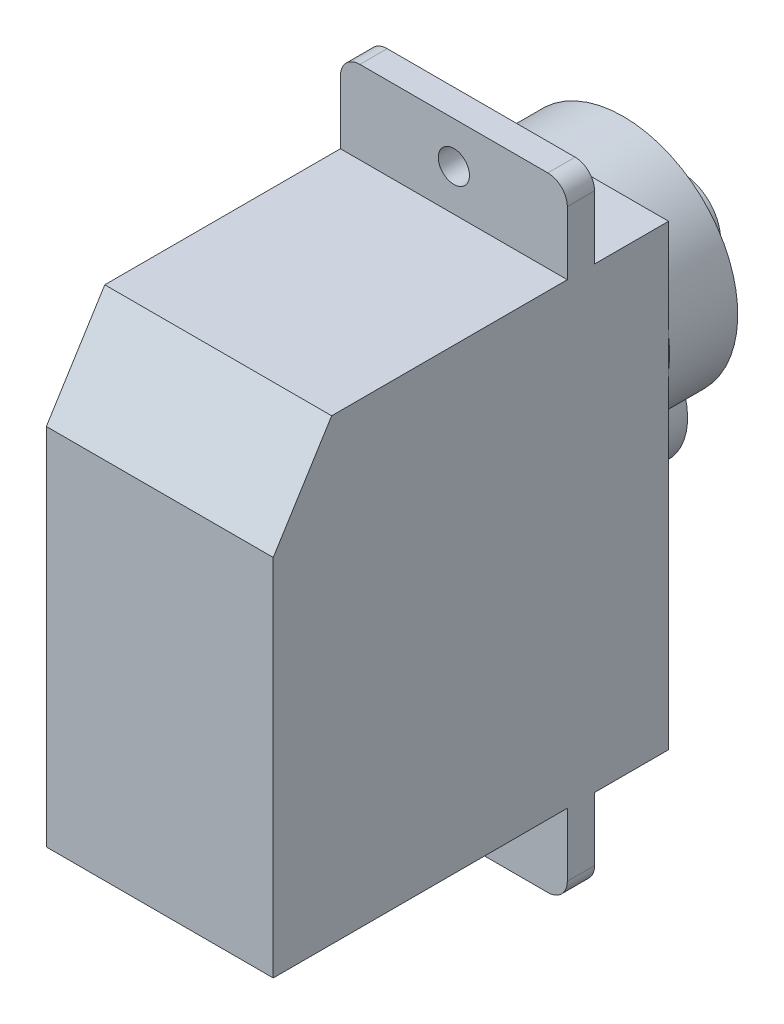
ISO-10303-21;
HEADER;
FILE_DESCRIPTION(('STEP AP214'),'2;1');
FILE_NAME('part.step','',(''),(''),'','','');
FILE_SCHEMA(('AUTOMOTIVE_DESIGN { 1 0 10303 214 1 1 1 1 }'));
ENDSEC;
DATA;
#1=APPLICATION_CONTEXT('core data for automotive mechanical design processes');
#2=APPLICATION_PROTOCOL_DEFINITION('international standard','automotive_design',2000,#1);
#3=PRODUCT_CONTEXT('',#1,'mechanical');
#4=PRODUCT('Part','Part','',(#3));
#5=PRODUCT_RELATED_PRODUCT_CATEGORY('part','',(#4));
#6=PRODUCT_DEFINITION_FORMATION('','',#4);
#7=PRODUCT_DEFINITION_CONTEXT('part definition',#1,'design');
#8=PRODUCT_DEFINITION('design','',#6,#7);
#9=PRODUCT_DEFINITION_SHAPE('','',#8);
#10=(LENGTH_UNIT() NAMED_UNIT(*) SI_UNIT(.MILLI.,.METRE.));
#11=(NAMED_UNIT(*) PLANE_ANGLE_UNIT() SI_UNIT($,.RADIAN.));
#12=(NAMED_UNIT(*) SI_UNIT($,.STERADIAN.) SOLID_ANGLE_UNIT());
#13=UNCERTAINTY_MEASURE_WITH_UNIT(LENGTH_MEASURE(1.E-05),#10,'distance_accuracy_value','');
#14=(GEOMETRIC_REPRESENTATION_CONTEXT(3) GLOBAL_UNCERTAINTY_ASSIGNED_CONTEXT((#13)) GLOBAL_UNIT_ASSIGNED_CONTEXT((#10,
#11,#12)) REPRESENTATION_CONTEXT('',''));
#15=CARTESIAN_POINT('',(0.,0.,0.));
#16=DIRECTION('',(0.,0.,1.));
#17=DIRECTION('',(1.,0.,0.));
#18=AXIS2_PLACEMENT_3D('',#15,#16,#17);
#19=CARTESIAN_POINT('',(0.,0.,-4.5));
#20=DIRECTION('',(0.,0.,-1.));
#21=DIRECTION('',(-1.,0.,0.));
#22=AXIS2_PLACEMENT_3D('',#19,#20,#21);
#23=PLANE('',#22);
#24=CARTESIAN_POINT('',(0.,0.,-4.5));
#25=DIRECTION('',(0.,0.,-1.));
#26=DIRECTION('',(-1.,0.,0.));
#27=AXIS2_PLACEMENT_3D('',#24,#25,#26);
#28=CIRCLE('',#27,1.);
#29=CARTESIAN_POINT('',(-1.,0.,-4.5));
#30=VERTEX_POINT('',#29);
#31=EDGE_CURVE('E19',#30,#30,#28,.F.);
#32=ORIENTED_EDGE('',*,*,#31,.F.);
#33=EDGE_LOOP('',(#32));
#34=FACE_BOUND('',#33,.T.);
#35=ADVANCED_FACE('F16',(#34),#23,.T.);
#36=CARTESIAN_POINT('',(0.,0.,-6.5));
#37=DIRECTION('',(0.,0.,-1.));
#38=DIRECTION('',(-1.,0.,0.));
#39=AXIS2_PLACEMENT_3D('',#36,#37,#38);
#40=PLANE('',#39);
#41=CARTESIAN_POINT('',(0.,5.75,-6.5));
#42=DIRECTION('',(0.,0.,-1.));
#43=DIRECTION('',(-1.,0.,0.));
#44=AXIS2_PLACEMENT_3D('',#41,#42,#43);
#45=CIRCLE('',#44,2.);
#46=CARTESIAN_POINT('',(-2.,5.75,-6.5));
#47=VERTEX_POINT('',#46);
#48=EDGE_CURVE('E314',#47,#47,#45,.F.);
#49=ORIENTED_EDGE('',*,*,#48,.F.);
#50=EDGE_LOOP('',(#49));
#51=FACE_BOUND('',#50,.T.);
#52=ADVANCED_FACE('F329',(#51),#40,.T.);
#53=CARTESIAN_POINT('',(0.,0.,-3.5));
#54=DIRECTION('',(0.,0.,-1.));
#55=DIRECTION('',(-1.,0.,0.));
#56=AXIS2_PLACEMENT_3D('',#53,#54,#55);
#57=CYLINDRICAL_SURFACE('',#56,1.);
#58=ORIENTED_EDGE('',*,*,#31,.T.);
#59=EDGE_LOOP('',(#58));
#60=FACE_BOUND('',#59,.T.);
#61=CARTESIAN_POINT('',(0.,0.,-3.5));
#62=DIRECTION('',(0.,0.,-1.));
#63=DIRECTION('',(-1.,0.,0.));
#64=AXIS2_PLACEMENT_3D('',#61,#62,#63);
#65=CIRCLE('',#64,1.);
#66=CARTESIAN_POINT('',(-1.,0.,-3.5));
#67=VERTEX_POINT('',#66);
#68=EDGE_CURVE('E311',#67,#67,#65,.F.);
#69=ORIENTED_EDGE('',*,*,#68,.F.);
#70=EDGE_LOOP('',(#69));
#71=FACE_BOUND('',#70,.T.);
#72=ADVANCED_FACE('F325',(#60,#71),#57,.T.);
#73=CARTESIAN_POINT('',(0.,5.75,-3.5));
#74=DIRECTION('',(0.,0.,-1.));
#75=DIRECTION('',(-1.,0.,0.));
#76=AXIS2_PLACEMENT_3D('',#73,#74,#75);
#77=CYLINDRICAL_SURFACE('',#76,2.);
#78=ORIENTED_EDGE('',*,*,#48,.T.);
#79=EDGE_LOOP('',(#78));
#80=FACE_BOUND('',#79,.T.);
#81=CARTESIAN_POINT('',(0.,5.75,-3.5));
#82=DIRECTION('',(0.,0.,-1.));
#83=DIRECTION('',(-1.,0.,0.));
#84=AXIS2_PLACEMENT_3D('',#81,#82,#83);
#85=CIRCLE('',#84,2.);
#86=CARTESIAN_POINT('',(-2.,5.75,-3.5));
#87=VERTEX_POINT('',#86);
#88=EDGE_CURVE('E209',#87,#87,#85,.F.);
#89=ORIENTED_EDGE('',*,*,#88,.F.);
#90=EDGE_LOOP('',(#89));
#91=FACE_BOUND('',#90,.T.);
#92=ADVANCED_FACE('F445',(#80,#91),#77,.T.);
#93=CARTESIAN_POINT('',(0.,0.,-3.5));
#94=DIRECTION('',(0.,0.,-1.));
#95=DIRECTION('',(-1.,0.,0.));
#96=AXIS2_PLACEMENT_3D('',#93,#94,#95);
#97=PLANE('',#96);
#98=ORIENTED_EDGE('',*,*,#88,.T.);
#99=EDGE_LOOP('',(#98));
#100=FACE_BOUND('',#99,.T.);
#101=ORIENTED_EDGE('',*,*,#68,.T.);
#102=EDGE_LOOP('',(#101));
#103=FACE_BOUND('',#102,.T.);
#104=CARTESIAN_POINT('',(0.,5.875,-3.5));
#105=DIRECTION('',(0.,0.,-1.));
#106=DIRECTION('',(-1.,0.,0.));
#107=AXIS2_PLACEMENT_3D('',#104,#105,#106);
#108=CIRCLE('',#107,5.875);
#109=CARTESIAN_POINT('',(3.16717949990341,0.926808510638298,-3.5));
#110=VERTEX_POINT('',#109);
#111=CARTESIAN_POINT('',(-3.16717949990341,0.926808510638298,-3.5));
#112=VERTEX_POINT('',#111);
#113=EDGE_CURVE('E174',#110,#112,#108,.F.);
#114=ORIENTED_EDGE('',*,*,#113,.F.);
#115=CARTESIAN_POINT('',(0.,0.,-3.5));
#116=DIRECTION('',(0.,0.,-1.));
#117=DIRECTION('',(-1.,0.,0.));
#118=AXIS2_PLACEMENT_3D('',#115,#116,#117);
#119=CIRCLE('',#118,3.3);
#120=EDGE_CURVE('E160',#112,#110,#119,.F.);
#121=ORIENTED_EDGE('',*,*,#120,.F.);
#122=EDGE_LOOP('',(#114,#121));
#123=FACE_BOUND('',#122,.T.);
#124=ADVANCED_FACE('F175',(#100,#103,#123),#97,.T.);
#125=CARTESIAN_POINT('',(0.,0.,0.));
#126=DIRECTION('',(0.,0.,-1.));
#127=DIRECTION('',(-1.,0.,0.));
#128=AXIS2_PLACEMENT_3D('',#125,#126,#127);
#129=PLANE('',#128);
#130=CARTESIAN_POINT('',(0.,5.875,0.));
#131=DIRECTION('',(0.,0.,-1.));
#132=DIRECTION('',(-1.,0.,0.));
#133=AXIS2_PLACEMENT_3D('',#130,#131,#132);
#134=CIRCLE('',#133,5.875);
#135=CARTESIAN_POINT('',(-5.825,5.11014707296108,0.));
#136=VERTEX_POINT('',#135);
#137=CARTESIAN_POINT('',(-5.825,6.63985292703892,0.));
#138=VERTEX_POINT('',#137);
#139=EDGE_CURVE('E171',#136,#138,#134,.T.);
#140=ORIENTED_EDGE('',*,*,#139,.F.);
#141=DIRECTION('',(0.,-1.,0.));
#142=VECTOR('',#141,1.);
#143=CARTESIAN_POINT('',(-5.825,11.75,0.));
#144=LINE('',#143,#142);
#145=EDGE_CURVE('E201',#138,#136,#144,.T.);
#146=ORIENTED_EDGE('',*,*,#145,.F.);
#147=EDGE_LOOP('',(#140,#146));
#148=FACE_BOUND('',#147,.T.);
#149=ADVANCED_FACE('F438',(#148),#129,.F.);
#150=CARTESIAN_POINT('',(-4.825,-15.,9.2));
#151=DIRECTION('',(0.,0.,-1.));
#152=DIRECTION('',(-1.,0.,0.));
#153=AXIS2_PLACEMENT_3D('',#150,#151,#152);
#154=CYLINDRICAL_SURFACE('',#153,1.);
#155=DIRECTION('',(0.,0.,1.));
#156=VECTOR('',#155,1.);
#157=CARTESIAN_POINT('',(-4.825,-16.,0.));
#158=LINE('',#157,#156);
#159=CARTESIAN_POINT('',(-4.825,-16.,5.2));
#160=VERTEX_POINT('',#159);
#161=CARTESIAN_POINT('',(-4.825,-16.,3.8));
#162=VERTEX_POINT('',#161);
#163=EDGE_CURVE('E172',#160,#162,#158,.F.);
#164=ORIENTED_EDGE('',*,*,#163,.F.);
#165=CARTESIAN_POINT('',(-4.825,-15.,5.2));
#166=DIRECTION('',(0.,0.,-1.));
#167=DIRECTION('',(-1.,0.,0.));
#168=AXIS2_PLACEMENT_3D('',#165,#166,#167);
#169=CIRCLE('',#168,1.);
#170=CARTESIAN_POINT('',(-5.825,-15.,5.2));
#171=VERTEX_POINT('',#170);
#172=EDGE_CURVE('E222',#171,#160,#169,.F.);
#173=ORIENTED_EDGE('',*,*,#172,.F.);
#174=DIRECTION('',(0.,0.,1.));
#175=VECTOR('',#174,1.);
#176=CARTESIAN_POINT('',(-5.825,-15.,0.));
#177=LINE('',#176,#175);
#178=CARTESIAN_POINT('',(-5.825,-15.,3.8));
#179=VERTEX_POINT('',#178);
#180=EDGE_CURVE('E204',#179,#171,#177,.T.);
#181=ORIENTED_EDGE('',*,*,#180,.F.);
#182=CARTESIAN_POINT('',(-4.825,-15.,3.8));
#183=DIRECTION('',(0.,0.,-1.));
#184=DIRECTION('',(-1.,0.,0.));
#185=AXIS2_PLACEMENT_3D('',#182,#183,#184);
#186=CIRCLE('',#185,1.);
#187=EDGE_CURVE('E213',#162,#179,#186,.T.);
#188=ORIENTED_EDGE('',*,*,#187,.F.);
#189=EDGE_LOOP('',(#164,#173,#181,#188));
#190=FACE_BOUND('',#189,.T.);
#191=ADVANCED_FACE('F434',(#190),#154,.T.);
#192=CARTESIAN_POINT('',(0.,-16.,0.));
#193=DIRECTION('',(0.,-1.,0.));
#194=DIRECTION('',(1.,0.,0.));
#195=AXIS2_PLACEMENT_3D('',#192,#193,#194);
#196=PLANE('',#195);
#197=DIRECTION('',(0.,0.,1.));
#198=VECTOR('',#197,1.);
#199=CARTESIAN_POINT('',(4.825,-16.,-0.200000000000001));
#200=LINE('',#199,#198);
#201=CARTESIAN_POINT('',(4.825,-16.,5.2));
#202=VERTEX_POINT('',#201);
#203=CARTESIAN_POINT('',(4.825,-16.,3.8));
#204=VERTEX_POINT('',#203);
#205=EDGE_CURVE('E210',#202,#204,#200,.F.);
#206=ORIENTED_EDGE('',*,*,#205,.F.);
#207=DIRECTION('',(1.,0.,0.));
#208=VECTOR('',#207,1.);
#209=CARTESIAN_POINT('',(5.82499999999999,-16.,5.2));
#210=LINE('',#209,#208);
#211=EDGE_CURVE('E303',#160,#202,#210,.T.);
#212=ORIENTED_EDGE('',*,*,#211,.F.);
#213=ORIENTED_EDGE('',*,*,#163,.T.);
#214=DIRECTION('',(1.,0.,0.));
#215=VECTOR('',#214,1.);
#216=CARTESIAN_POINT('',(-5.825,-16.,3.8));
#217=LINE('',#216,#215);
#218=EDGE_CURVE('E283',#204,#162,#217,.F.);
#219=ORIENTED_EDGE('',*,*,#218,.F.);
#220=EDGE_LOOP('',(#206,#212,#213,#219));
#221=FACE_BOUND('',#220,.T.);
#222=ADVANCED_FACE('F430',(#221),#196,.T.);
#223=CARTESIAN_POINT('',(0.,-13.875,20.3));
#224=DIRECTION('',(0.,0.,-1.));
#225=DIRECTION('',(0.,1.,0.));
#226=AXIS2_PLACEMENT_3D('',#223,#224,#225);
#227=CYLINDRICAL_SURFACE('',#226,0.8);
#228=CARTESIAN_POINT('',(0.,-13.875,3.8));
#229=DIRECTION('',(0.,0.,-1.));
#230=DIRECTION('',(0.,1.,0.));
#231=AXIS2_PLACEMENT_3D('',#228,#229,#230);
#232=CIRCLE('',#231,0.8);
#233=CARTESIAN_POINT('',(0.,-13.075,3.8));
#234=VERTEX_POINT('',#233);
#235=EDGE_CURVE('E279',#234,#234,#232,.F.);
#236=ORIENTED_EDGE('',*,*,#235,.F.);
#237=EDGE_LOOP('',(#236));
#238=FACE_BOUND('',#237,.T.);
#239=CARTESIAN_POINT('',(0.,-13.875,5.2));
#240=DIRECTION('',(0.,0.,-1.));
#241=DIRECTION('',(0.,1.,0.));
#242=AXIS2_PLACEMENT_3D('',#239,#240,#241);
#243=CIRCLE('',#242,0.8);
#244=CARTESIAN_POINT('',(0.,-13.075,5.2));
#245=VERTEX_POINT('',#244);
#246=EDGE_CURVE('E295',#245,#245,#243,.T.);
#247=ORIENTED_EDGE('',*,*,#246,.F.);
#248=EDGE_LOOP('',(#247));
#249=FACE_BOUND('',#248,.T.);
#250=ADVANCED_FACE('F427',(#238,#249),#227,.F.);
#251=CARTESIAN_POINT('',(0.,0.,0.));
#252=DIRECTION('',(0.,0.,-1.));
#253=DIRECTION('',(-1.,0.,0.));
#254=AXIS2_PLACEMENT_3D('',#251,#252,#253);
#255=CYLINDRICAL_SURFACE('',#254,3.3);
#256=ORIENTED_EDGE('',*,*,#120,.T.);
#257=DIRECTION('',(0.,0.,-1.));
#258=VECTOR('',#257,1.);
#259=CARTESIAN_POINT('',(3.16717949990341,0.926808510638299,0.));
#260=LINE('',#259,#258);
#261=CARTESIAN_POINT('',(3.16717949990341,0.926808510638298,0.));
#262=VERTEX_POINT('',#261);
#263=EDGE_CURVE('E165',#262,#110,#260,.T.);
#264=ORIENTED_EDGE('',*,*,#263,.F.);
#265=CARTESIAN_POINT('',(0.,0.,0.));
#266=DIRECTION('',(0.,0.,-1.));
#267=DIRECTION('',(-1.,0.,0.));
#268=AXIS2_PLACEMENT_3D('',#265,#266,#267);
#269=CIRCLE('',#268,3.3);
#270=CARTESIAN_POINT('',(-3.16717949990341,0.926808510638298,0.));
#271=VERTEX_POINT('',#270);
#272=EDGE_CURVE('E273',#262,#271,#269,.T.);
#273=ORIENTED_EDGE('',*,*,#272,.T.);
#274=DIRECTION('',(0.,0.,-1.));
#275=VECTOR('',#274,1.);
#276=CARTESIAN_POINT('',(-3.16717949990341,0.926808510638298,0.));
#277=LINE('',#276,#275);
#278=EDGE_CURVE('E168',#112,#271,#277,.F.);
#279=ORIENTED_EDGE('',*,*,#278,.F.);
#280=EDGE_LOOP('',(#256,#264,#273,#279));
#281=FACE_BOUND('',#280,.T.);
#282=ADVANCED_FACE('F163',(#281),#255,.T.);
#283=CARTESIAN_POINT('',(0.,5.875,0.));
#284=DIRECTION('',(0.,0.,-1.));
#285=DIRECTION('',(-1.,0.,0.));
#286=AXIS2_PLACEMENT_3D('',#283,#284,#285);
#287=CYLINDRICAL_SURFACE('',#286,5.875);
#288=ORIENTED_EDGE('',*,*,#113,.T.);
#289=ORIENTED_EDGE('',*,*,#278,.T.);
#290=CARTESIAN_POINT('',(0.,5.875,0.));
#291=DIRECTION('',(0.,0.,-1.));
#292=DIRECTION('',(-1.,0.,0.));
#293=AXIS2_PLACEMENT_3D('',#290,#291,#292);
#294=CIRCLE('',#293,5.875);
#295=EDGE_CURVE('E269',#271,#136,#294,.T.);
#296=ORIENTED_EDGE('',*,*,#295,.T.);
#297=ORIENTED_EDGE('',*,*,#139,.T.);
#298=CARTESIAN_POINT('',(0.,5.875,0.));
#299=DIRECTION('',(0.,0.,-1.));
#300=DIRECTION('',(-1.,0.,0.));
#301=AXIS2_PLACEMENT_3D('',#298,#299,#300);
#302=CIRCLE('',#301,5.875);
#303=CARTESIAN_POINT('',(0.,11.75,0.));
#304=VERTEX_POINT('',#303);
#305=EDGE_CURVE('E304',#138,#304,#302,.T.);
#306=ORIENTED_EDGE('',*,*,#305,.T.);
#307=CARTESIAN_POINT('',(0.,5.875,0.));
#308=DIRECTION('',(0.,0.,-1.));
#309=DIRECTION('',(-1.,0.,0.));
#310=AXIS2_PLACEMENT_3D('',#307,#308,#309);
#311=CIRCLE('',#310,5.875);
#312=CARTESIAN_POINT('',(5.825,6.63985292703889,0.));
#313=VERTEX_POINT('',#312);
#314=EDGE_CURVE('E262',#304,#313,#311,.T.);
#315=ORIENTED_EDGE('',*,*,#314,.T.);
#316=CARTESIAN_POINT('',(0.,5.875,0.));
#317=DIRECTION('',(0.,0.,-1.));
#318=DIRECTION('',(-1.,0.,0.));
#319=AXIS2_PLACEMENT_3D('',#316,#317,#318);
#320=CIRCLE('',#319,5.875);
#321=CARTESIAN_POINT('',(5.82500000000001,5.11014707296111,0.));
#322=VERTEX_POINT('',#321);
#323=EDGE_CURVE('E266',#313,#322,#320,.T.);
#324=ORIENTED_EDGE('',*,*,#323,.T.);
#325=CARTESIAN_POINT('',(0.,5.875,0.));
#326=DIRECTION('',(0.,0.,-1.));
#327=DIRECTION('',(-1.,0.,0.));
#328=AXIS2_PLACEMENT_3D('',#325,#326,#327);
#329=CIRCLE('',#328,5.875);
#330=EDGE_CURVE('E181',#322,#262,#329,.T.);
#331=ORIENTED_EDGE('',*,*,#330,.T.);
#332=ORIENTED_EDGE('',*,*,#263,.T.);
#333=EDGE_LOOP('',(#288,#289,#296,#297,#306,#315,#324,#331,#332));
#334=FACE_BOUND('',#333,.T.);
#335=ADVANCED_FACE('F179',(#334),#287,.T.);
#336=CARTESIAN_POINT('',(0.,0.,0.));
#337=DIRECTION('',(0.,0.,1.));
#338=DIRECTION('',(1.,0.,0.));
#339=AXIS2_PLACEMENT_3D('',#336,#337,#338);
#340=PLANE('',#339);
#341=DIRECTION('',(0.,-1.,0.));
#342=VECTOR('',#341,1.);
#343=CARTESIAN_POINT('',(-5.825,11.75,0.));
#344=LINE('',#343,#342);
#345=CARTESIAN_POINT('',(-5.825,11.75,0.));
#346=VERTEX_POINT('',#345);
#347=EDGE_CURVE('E205',#346,#138,#344,.T.);
#348=ORIENTED_EDGE('',*,*,#347,.F.);
#349=DIRECTION('',(1.,0.,0.));
#350=VECTOR('',#349,1.);
#351=CARTESIAN_POINT('',(5.825,11.75,0.));
#352=LINE('',#351,#350);
#353=EDGE_CURVE('E896',#304,#346,#352,.F.);
#354=ORIENTED_EDGE('',*,*,#353,.F.);
#355=ORIENTED_EDGE('',*,*,#305,.F.);
#356=EDGE_LOOP('',(#348,#354,#355));
#357=FACE_BOUND('',#356,.T.);
#358=ADVANCED_FACE('F418',(#357),#340,.F.);
#359=CARTESIAN_POINT('',(-4.825,15.,9.2));
#360=DIRECTION('',(0.,0.,1.));
#361=DIRECTION('',(1.,0.,0.));
#362=AXIS2_PLACEMENT_3D('',#359,#360,#361);
#363=CYLINDRICAL_SURFACE('',#362,1.);
#364=DIRECTION('',(0.,0.,1.));
#365=VECTOR('',#364,1.);
#366=CARTESIAN_POINT('',(-4.825,16.,0.));
#367=LINE('',#366,#365);
#368=CARTESIAN_POINT('',(-4.825,16.,5.2));
#369=VERTEX_POINT('',#368);
#370=CARTESIAN_POINT('',(-4.825,16.,3.8));
#371=VERTEX_POINT('',#370);
#372=EDGE_CURVE('E306',#369,#371,#367,.F.);
#373=ORIENTED_EDGE('',*,*,#372,.T.);
#374=CARTESIAN_POINT('',(-4.825,15.,3.8));
#375=DIRECTION('',(0.,0.,1.));
#376=DIRECTION('',(1.,0.,0.));
#377=AXIS2_PLACEMENT_3D('',#374,#375,#376);
#378=CIRCLE('',#377,1.);
#379=CARTESIAN_POINT('',(-5.825,15.,3.8));
#380=VERTEX_POINT('',#379);
#381=EDGE_CURVE('E256',#380,#371,#378,.F.);
#382=ORIENTED_EDGE('',*,*,#381,.F.);
#383=DIRECTION('',(0.,0.,1.));
#384=VECTOR('',#383,1.);
#385=CARTESIAN_POINT('',(-5.825,15.,0.));
#386=LINE('',#385,#384);
#387=CARTESIAN_POINT('',(-5.825,15.,5.2));
#388=VERTEX_POINT('',#387);
#389=EDGE_CURVE('E889',#388,#380,#386,.F.);
#390=ORIENTED_EDGE('',*,*,#389,.F.);
#391=CARTESIAN_POINT('',(-4.825,15.,5.2));
#392=DIRECTION('',(0.,0.,1.));
#393=DIRECTION('',(1.,0.,0.));
#394=AXIS2_PLACEMENT_3D('',#391,#392,#393);
#395=CIRCLE('',#394,1.);
#396=EDGE_CURVE('E242',#369,#388,#395,.T.);
#397=ORIENTED_EDGE('',*,*,#396,.F.);
#398=EDGE_LOOP('',(#373,#382,#390,#397));
#399=FACE_BOUND('',#398,.T.);
#400=ADVANCED_FACE('F414',(#399),#363,.T.);
#401=CARTESIAN_POINT('',(0.,16.,0.));
#402=DIRECTION('',(0.,-1.,0.));
#403=DIRECTION('',(1.,0.,0.));
#404=AXIS2_PLACEMENT_3D('',#401,#402,#403);
#405=PLANE('',#404);
#406=DIRECTION('',(1.,0.,0.));
#407=VECTOR('',#406,1.);
#408=CARTESIAN_POINT('',(5.82499999999999,16.,5.2));
#409=LINE('',#408,#407);
#410=CARTESIAN_POINT('',(4.825,16.,5.2));
#411=VERTEX_POINT('',#410);
#412=EDGE_CURVE('E236',#411,#369,#409,.F.);
#413=ORIENTED_EDGE('',*,*,#412,.F.);
#414=DIRECTION('',(0.,0.,-1.));
#415=VECTOR('',#414,1.);
#416=CARTESIAN_POINT('',(4.825,16.,-0.199999999999999));
#417=LINE('',#416,#415);
#418=CARTESIAN_POINT('',(4.825,16.,3.8));
#419=VERTEX_POINT('',#418);
#420=EDGE_CURVE('E246',#419,#411,#417,.F.);
#421=ORIENTED_EDGE('',*,*,#420,.F.);
#422=DIRECTION('',(1.,0.,0.));
#423=VECTOR('',#422,1.);
#424=CARTESIAN_POINT('',(-5.825,16.,3.8));
#425=LINE('',#424,#423);
#426=EDGE_CURVE('E260',#371,#419,#425,.T.);
#427=ORIENTED_EDGE('',*,*,#426,.F.);
#428=ORIENTED_EDGE('',*,*,#372,.F.);
#429=EDGE_LOOP('',(#413,#421,#427,#428));
#430=FACE_BOUND('',#429,.T.);
#431=ADVANCED_FACE('F410',(#430),#405,.F.);
#432=CARTESIAN_POINT('',(0.,13.875,20.3));
#433=DIRECTION('',(0.,0.,-1.));
#434=DIRECTION('',(0.,1.,0.));
#435=AXIS2_PLACEMENT_3D('',#432,#433,#434);
#436=CYLINDRICAL_SURFACE('',#435,0.8);
#437=CARTESIAN_POINT('',(0.,13.875,3.8));
#438=DIRECTION('',(0.,0.,-1.));
#439=DIRECTION('',(0.,1.,0.));
#440=AXIS2_PLACEMENT_3D('',#437,#438,#439);
#441=CIRCLE('',#440,0.8);
#442=CARTESIAN_POINT('',(0.,14.675,3.8));
#443=VERTEX_POINT('',#442);
#444=EDGE_CURVE('E251',#443,#443,#441,.F.);
#445=ORIENTED_EDGE('',*,*,#444,.F.);
#446=EDGE_LOOP('',(#445));
#447=FACE_BOUND('',#446,.T.);
#448=CARTESIAN_POINT('',(0.,13.875,5.2));
#449=DIRECTION('',(0.,0.,-1.));
#450=DIRECTION('',(0.,1.,0.));
#451=AXIS2_PLACEMENT_3D('',#448,#449,#450);
#452=CIRCLE('',#451,0.8);
#453=CARTESIAN_POINT('',(0.,14.675,5.2));
#454=VERTEX_POINT('',#453);
#455=EDGE_CURVE('E231',#454,#454,#452,.T.);
#456=ORIENTED_EDGE('',*,*,#455,.F.);
#457=EDGE_LOOP('',(#456));
#458=FACE_BOUND('',#457,.T.);
#459=ADVANCED_FACE('F406',(#447,#458),#436,.F.);
#460=CARTESIAN_POINT('',(-5.825,11.75,0.));
#461=DIRECTION('',(-1.,0.,0.));
#462=DIRECTION('',(0.,-1.,0.));
#463=AXIS2_PLACEMENT_3D('',#460,#461,#462);
#464=PLANE('',#463);
#465=DIRECTION('',(0.,0.,-1.));
#466=VECTOR('',#465,1.);
#467=CARTESIAN_POINT('',(-5.825,-11.75,0.));
#468=LINE('',#467,#466);
#469=CARTESIAN_POINT('',(-5.825,-11.75,20.3));
#470=VERTEX_POINT('',#469);
#471=CARTESIAN_POINT('',(-5.825,-11.75,5.2));
#472=VERTEX_POINT('',#471);
#473=EDGE_CURVE('E219',#470,#472,#468,.T.);
#474=ORIENTED_EDGE('',*,*,#473,.F.);
#475=DIRECTION('',(0.,1.,0.));
#476=VECTOR('',#475,1.);
#477=CARTESIAN_POINT('',(-5.825,0.,20.3));
#478=LINE('',#477,#476);
#479=CARTESIAN_POINT('',(-5.825,6.94999999999997,20.3));
#480=VERTEX_POINT('',#479);
#481=EDGE_CURVE('E226',#480,#470,#478,.F.);
#482=ORIENTED_EDGE('',*,*,#481,.F.);
#483=DIRECTION('',(0.,0.847998304005089,-0.529998940003179));
#484=VECTOR('',#483,1.);
#485=CARTESIAN_POINT('',(-5.825,11.75,17.3));
#486=LINE('',#485,#484);
#487=CARTESIAN_POINT('',(-5.825,11.75,17.3));
#488=VERTEX_POINT('',#487);
#489=EDGE_CURVE('E218',#480,#488,#486,.T.);
#490=ORIENTED_EDGE('',*,*,#489,.T.);
#491=DIRECTION('',(0.,0.,1.));
#492=VECTOR('',#491,1.);
#493=CARTESIAN_POINT('',(-5.825,11.75,0.));
#494=LINE('',#493,#492);
#495=CARTESIAN_POINT('',(-5.825,11.75,5.2));
#496=VERTEX_POINT('',#495);
#497=EDGE_CURVE('E870',#496,#488,#494,.T.);
#498=ORIENTED_EDGE('',*,*,#497,.F.);
#499=DIRECTION('',(0.,-1.,0.));
#500=VECTOR('',#499,1.);
#501=CARTESIAN_POINT('',(-5.825,16.,5.2));
#502=LINE('',#501,#500);
#503=EDGE_CURVE('E241',#388,#496,#502,.T.);
#504=ORIENTED_EDGE('',*,*,#503,.F.);
#505=ORIENTED_EDGE('',*,*,#389,.T.);
#506=DIRECTION('',(0.,1.,0.));
#507=VECTOR('',#506,1.);
#508=CARTESIAN_POINT('',(-5.825,16.,3.8));
#509=LINE('',#508,#507);
#510=CARTESIAN_POINT('',(-5.825,11.75,3.8));
#511=VERTEX_POINT('',#510);
#512=EDGE_CURVE('E255',#511,#380,#509,.T.);
#513=ORIENTED_EDGE('',*,*,#512,.F.);
#514=DIRECTION('',(0.,0.,1.));
#515=VECTOR('',#514,1.);
#516=CARTESIAN_POINT('',(-5.825,11.75,0.));
#517=LINE('',#516,#515);
#518=EDGE_CURVE('E261',#346,#511,#517,.T.);
#519=ORIENTED_EDGE('',*,*,#518,.F.);
#520=ORIENTED_EDGE('',*,*,#347,.T.);
#521=ORIENTED_EDGE('',*,*,#145,.T.);
#522=DIRECTION('',(0.,1.,0.));
#523=VECTOR('',#522,1.);
#524=CARTESIAN_POINT('',(-5.825,0.,0.));
#525=LINE('',#524,#523);
#526=CARTESIAN_POINT('',(-5.825,-11.75,0.));
#527=VERTEX_POINT('',#526);
#528=EDGE_CURVE('E197',#136,#527,#525,.F.);
#529=ORIENTED_EDGE('',*,*,#528,.T.);
#530=DIRECTION('',(0.,0.,-1.));
#531=VECTOR('',#530,1.);
#532=CARTESIAN_POINT('',(-5.825,-11.75,0.));
#533=LINE('',#532,#531);
#534=CARTESIAN_POINT('',(-5.825,-11.75,3.8));
#535=VERTEX_POINT('',#534);
#536=EDGE_CURVE('E193',#535,#527,#533,.T.);
#537=ORIENTED_EDGE('',*,*,#536,.F.);
#538=DIRECTION('',(0.,1.,0.));
#539=VECTOR('',#538,1.);
#540=CARTESIAN_POINT('',(-5.825,16.,3.8));
#541=LINE('',#540,#539);
#542=EDGE_CURVE('E288',#179,#535,#541,.T.);
#543=ORIENTED_EDGE('',*,*,#542,.F.);
#544=ORIENTED_EDGE('',*,*,#180,.T.);
#545=DIRECTION('',(0.,-1.,0.));
#546=VECTOR('',#545,1.);
#547=CARTESIAN_POINT('',(-5.825,16.,5.2));
#548=LINE('',#547,#546);
#549=EDGE_CURVE('E299',#472,#171,#548,.T.);
#550=ORIENTED_EDGE('',*,*,#549,.F.);
#551=EDGE_LOOP('',(#474,#482,#490,#498,#504,#505,#513,#519,#520,#521,#529,#537,#543,#544,#550));
#552=FACE_BOUND('',#551,.T.);
#553=ADVANCED_FACE('F402',(#552),#464,.T.);
#554=CARTESIAN_POINT('',(5.875,11.75,17.3));
#555=DIRECTION('',(0.,-0.529998940003179,-0.847998304005089));
#556=DIRECTION('',(0.,0.847998304005089,-0.529998940003179));
#557=AXIS2_PLACEMENT_3D('',#554,#555,#556);
#558=PLANE('',#557);
#559=DIRECTION('',(1.,0.,0.));
#560=VECTOR('',#559,1.);
#561=CARTESIAN_POINT('',(5.825,11.75,17.3));
#562=LINE('',#561,#560);
#563=CARTESIAN_POINT('',(5.825,11.75,17.3));
#564=VERTEX_POINT('',#563);
#565=EDGE_CURVE('E235',#488,#564,#562,.T.);
#566=ORIENTED_EDGE('',*,*,#565,.F.);
#567=ORIENTED_EDGE('',*,*,#489,.F.);
#568=DIRECTION('',(1.,0.,0.));
#569=VECTOR('',#568,1.);
#570=CARTESIAN_POINT('',(0.,6.94999999999997,20.3));
#571=LINE('',#570,#569);
#572=CARTESIAN_POINT('',(5.825,6.94999999999997,20.3));
#573=VERTEX_POINT('',#572);
#574=EDGE_CURVE('E228',#573,#480,#571,.F.);
#575=ORIENTED_EDGE('',*,*,#574,.F.);
#576=DIRECTION('',(0.,-0.847998304005089,0.529998940003178));
#577=VECTOR('',#576,1.);
#578=CARTESIAN_POINT('',(5.825,11.75,17.3));
#579=LINE('',#578,#577);
#580=EDGE_CURVE('E859',#564,#573,#579,.T.);
#581=ORIENTED_EDGE('',*,*,#580,.F.);
#582=EDGE_LOOP('',(#566,#567,#575,#581));
#583=FACE_BOUND('',#582,.T.);
#584=ADVANCED_FACE('F398',(#583),#558,.F.);
#585=CARTESIAN_POINT('',(0.,0.,20.3));
#586=DIRECTION('',(0.,0.,1.));
#587=DIRECTION('',(1.,0.,0.));
#588=AXIS2_PLACEMENT_3D('',#585,#586,#587);
#589=PLANE('',#588);
#590=DIRECTION('',(1.,0.,0.));
#591=VECTOR('',#590,1.);
#592=CARTESIAN_POINT('',(-5.825,-11.75,20.3));
#593=LINE('',#592,#591);
#594=CARTESIAN_POINT('',(5.825,-11.75,20.3));
#595=VERTEX_POINT('',#594);
#596=EDGE_CURVE('E223',#595,#470,#593,.F.);
#597=ORIENTED_EDGE('',*,*,#596,.F.);
#598=DIRECTION('',(0.,1.,0.));
#599=VECTOR('',#598,1.);
#600=CARTESIAN_POINT('',(5.825,-11.75,20.3));
#601=LINE('',#600,#599);
#602=EDGE_CURVE('E848',#573,#595,#601,.F.);
#603=ORIENTED_EDGE('',*,*,#602,.F.);
#604=ORIENTED_EDGE('',*,*,#574,.T.);
#605=ORIENTED_EDGE('',*,*,#481,.T.);
#606=EDGE_LOOP('',(#597,#603,#604,#605));
#607=FACE_BOUND('',#606,.T.);
#608=ADVANCED_FACE('F394',(#607),#589,.T.);
#609=CARTESIAN_POINT('',(-5.825,-11.75,0.));
#610=DIRECTION('',(0.,-1.,0.));
#611=DIRECTION('',(0.,0.,-1.));
#612=AXIS2_PLACEMENT_3D('',#609,#610,#611);
#613=PLANE('',#612);
#614=ORIENTED_EDGE('',*,*,#596,.T.);
#615=ORIENTED_EDGE('',*,*,#473,.T.);
#616=DIRECTION('',(1.,0.,0.));
#617=VECTOR('',#616,1.);
#618=CARTESIAN_POINT('',(5.82499999999999,-11.75,5.2));
#619=LINE('',#618,#617);
#620=CARTESIAN_POINT('',(5.825,-11.75,5.2));
#621=VERTEX_POINT('',#620);
#622=EDGE_CURVE('E835',#621,#472,#619,.F.);
#623=ORIENTED_EDGE('',*,*,#622,.F.);
#624=DIRECTION('',(0.,0.,1.));
#625=VECTOR('',#624,1.);
#626=CARTESIAN_POINT('',(5.825,-11.75,0.));
#627=LINE('',#626,#625);
#628=EDGE_CURVE('E829',#595,#621,#627,.F.);
#629=ORIENTED_EDGE('',*,*,#628,.F.);
#630=EDGE_LOOP('',(#614,#615,#623,#629));
#631=FACE_BOUND('',#630,.T.);
#632=ADVANCED_FACE('F390',(#631),#613,.T.);
#633=CARTESIAN_POINT('',(5.82499999999999,16.,5.2));
#634=DIRECTION('',(0.,0.,1.));
#635=DIRECTION('',(0.,-1.,0.));
#636=AXIS2_PLACEMENT_3D('',#633,#634,#635);
#637=PLANE('',#636);
#638=ORIENTED_EDGE('',*,*,#246,.T.);
#639=EDGE_LOOP('',(#638));
#640=FACE_BOUND('',#639,.T.);
#641=ORIENTED_EDGE('',*,*,#622,.T.);
#642=ORIENTED_EDGE('',*,*,#549,.T.);
#643=ORIENTED_EDGE('',*,*,#172,.T.);
#644=ORIENTED_EDGE('',*,*,#211,.T.);
#645=CARTESIAN_POINT('',(4.825,-15.,5.2));
#646=DIRECTION('',(0.,0.,1.));
#647=DIRECTION('',(1.,0.,0.));
#648=AXIS2_PLACEMENT_3D('',#645,#646,#647);
#649=CIRCLE('',#648,1.);
#650=CARTESIAN_POINT('',(5.825,-15.,5.2));
#651=VERTEX_POINT('',#650);
#652=EDGE_CURVE('E214',#651,#202,#649,.F.);
#653=ORIENTED_EDGE('',*,*,#652,.F.);
#654=DIRECTION('',(0.,1.,0.));
#655=VECTOR('',#654,1.);
#656=CARTESIAN_POINT('',(5.825,-11.75,5.2));
#657=LINE('',#656,#655);
#658=EDGE_CURVE('E825',#621,#651,#657,.F.);
#659=ORIENTED_EDGE('',*,*,#658,.F.);
#660=EDGE_LOOP('',(#641,#642,#643,#644,#653,#659));
#661=FACE_BOUND('',#660,.T.);
#662=ADVANCED_FACE('F386',(#640,#661),#637,.T.);
#663=CARTESIAN_POINT('',(4.825,-15.,-0.200000000000001));
#664=DIRECTION('',(0.,0.,1.));
#665=DIRECTION('',(1.,0.,0.));
#666=AXIS2_PLACEMENT_3D('',#663,#664,#665);
#667=CYLINDRICAL_SURFACE('',#666,1.);
#668=ORIENTED_EDGE('',*,*,#205,.T.);
#669=CARTESIAN_POINT('',(4.825,-15.,3.8));
#670=DIRECTION('',(0.,0.,1.));
#671=DIRECTION('',(1.,0.,0.));
#672=AXIS2_PLACEMENT_3D('',#669,#670,#671);
#673=CIRCLE('',#672,1.);
#674=CARTESIAN_POINT('',(5.825,-15.,3.8));
#675=VERTEX_POINT('',#674);
#676=EDGE_CURVE('E284',#675,#204,#673,.F.);
#677=ORIENTED_EDGE('',*,*,#676,.F.);
#678=DIRECTION('',(0.,0.,1.));
#679=VECTOR('',#678,1.);
#680=CARTESIAN_POINT('',(5.825,-15.,0.));
#681=LINE('',#680,#679);
#682=EDGE_CURVE('E812',#651,#675,#681,.F.);
#683=ORIENTED_EDGE('',*,*,#682,.F.);
#684=ORIENTED_EDGE('',*,*,#652,.T.);
#685=EDGE_LOOP('',(#668,#677,#683,#684));
#686=FACE_BOUND('',#685,.T.);
#687=ADVANCED_FACE('F382',(#686),#667,.T.);
#688=CARTESIAN_POINT('',(-5.825,16.,3.8));
#689=DIRECTION('',(0.,0.,-1.));
#690=DIRECTION('',(0.,1.,0.));
#691=AXIS2_PLACEMENT_3D('',#688,#689,#690);
#692=PLANE('',#691);
#693=ORIENTED_EDGE('',*,*,#235,.T.);
#694=EDGE_LOOP('',(#693));
#695=FACE_BOUND('',#694,.T.);
#696=ORIENTED_EDGE('',*,*,#676,.T.);
#697=ORIENTED_EDGE('',*,*,#218,.T.);
#698=ORIENTED_EDGE('',*,*,#187,.T.);
#699=ORIENTED_EDGE('',*,*,#542,.T.);
#700=DIRECTION('',(1.,0.,0.));
#701=VECTOR('',#700,1.);
#702=CARTESIAN_POINT('',(-5.825,-11.75,3.8));
#703=LINE('',#702,#701);
#704=CARTESIAN_POINT('',(5.825,-11.75,3.8));
#705=VERTEX_POINT('',#704);
#706=EDGE_CURVE('E198',#705,#535,#703,.F.);
#707=ORIENTED_EDGE('',*,*,#706,.F.);
#708=DIRECTION('',(0.,1.,0.));
#709=VECTOR('',#708,1.);
#710=CARTESIAN_POINT('',(5.825,-11.75,3.8));
#711=LINE('',#710,#709);
#712=EDGE_CURVE('E801',#675,#705,#711,.T.);
#713=ORIENTED_EDGE('',*,*,#712,.F.);
#714=EDGE_LOOP('',(#696,#697,#698,#699,#707,#713));
#715=FACE_BOUND('',#714,.T.);
#716=ADVANCED_FACE('F378',(#695,#715),#692,.T.);
#717=CARTESIAN_POINT('',(-5.825,-11.75,0.));
#718=DIRECTION('',(0.,-1.,0.));
#719=DIRECTION('',(0.,0.,-1.));
#720=AXIS2_PLACEMENT_3D('',#717,#718,#719);
#721=PLANE('',#720);
#722=DIRECTION('',(1.,0.,0.));
#723=VECTOR('',#722,1.);
#724=CARTESIAN_POINT('',(0.,-11.75,0.));
#725=LINE('',#724,#723);
#726=CARTESIAN_POINT('',(5.825,-11.75,0.));
#727=VERTEX_POINT('',#726);
#728=EDGE_CURVE('E278',#527,#727,#725,.T.);
#729=ORIENTED_EDGE('',*,*,#728,.T.);
#730=DIRECTION('',(0.,0.,1.));
#731=VECTOR('',#730,1.);
#732=CARTESIAN_POINT('',(5.825,-11.75,0.));
#733=LINE('',#732,#731);
#734=EDGE_CURVE('E796',#705,#727,#733,.F.);
#735=ORIENTED_EDGE('',*,*,#734,.F.);
#736=ORIENTED_EDGE('',*,*,#706,.T.);
#737=ORIENTED_EDGE('',*,*,#536,.T.);
#738=EDGE_LOOP('',(#729,#735,#736,#737));
#739=FACE_BOUND('',#738,.T.);
#740=ADVANCED_FACE('F374',(#739),#721,.T.);
#741=CARTESIAN_POINT('',(0.,0.,0.));
#742=DIRECTION('',(0.,0.,1.));
#743=DIRECTION('',(1.,0.,0.));
#744=AXIS2_PLACEMENT_3D('',#741,#742,#743);
#745=PLANE('',#744);
#746=ORIENTED_EDGE('',*,*,#272,.F.);
#747=ORIENTED_EDGE('',*,*,#330,.F.);
#748=DIRECTION('',(0.,1.,0.));
#749=VECTOR('',#748,1.);
#750=CARTESIAN_POINT('',(5.825,-11.75,0.));
#751=LINE('',#750,#749);
#752=EDGE_CURVE('E800',#727,#322,#751,.T.);
#753=ORIENTED_EDGE('',*,*,#752,.F.);
#754=ORIENTED_EDGE('',*,*,#728,.F.);
#755=ORIENTED_EDGE('',*,*,#528,.F.);
#756=ORIENTED_EDGE('',*,*,#295,.F.);
#757=EDGE_LOOP('',(#746,#747,#753,#754,#755,#756));
#758=FACE_BOUND('',#757,.T.);
#759=ADVANCED_FACE('F370',(#758),#745,.F.);
#760=CARTESIAN_POINT('',(0.,0.,0.));
#761=DIRECTION('',(0.,0.,-1.));
#762=DIRECTION('',(-1.,0.,0.));
#763=AXIS2_PLACEMENT_3D('',#760,#761,#762);
#764=PLANE('',#763);
#765=ORIENTED_EDGE('',*,*,#323,.F.);
#766=DIRECTION('',(0.,1.,0.));
#767=VECTOR('',#766,1.);
#768=CARTESIAN_POINT('',(5.825,-11.75,0.));
#769=LINE('',#768,#767);
#770=EDGE_CURVE('E923',#322,#313,#769,.T.);
#771=ORIENTED_EDGE('',*,*,#770,.F.);
#772=EDGE_LOOP('',(#765,#771));
#773=FACE_BOUND('',#772,.T.);
#774=ADVANCED_FACE('F366',(#773),#764,.F.);
#775=CARTESIAN_POINT('',(0.,0.,0.));
#776=DIRECTION('',(0.,0.,1.));
#777=DIRECTION('',(1.,0.,0.));
#778=AXIS2_PLACEMENT_3D('',#775,#776,#777);
#779=PLANE('',#778);
#780=DIRECTION('',(1.,0.,0.));
#781=VECTOR('',#780,1.);
#782=CARTESIAN_POINT('',(5.825,11.75,0.));
#783=LINE('',#782,#781);
#784=CARTESIAN_POINT('',(5.825,11.75,0.));
#785=VERTEX_POINT('',#784);
#786=EDGE_CURVE('E265',#785,#304,#783,.F.);
#787=ORIENTED_EDGE('',*,*,#786,.F.);
#788=DIRECTION('',(0.,1.,0.));
#789=VECTOR('',#788,1.);
#790=CARTESIAN_POINT('',(5.825,-11.75,0.));
#791=LINE('',#790,#789);
#792=EDGE_CURVE('E918',#313,#785,#791,.T.);
#793=ORIENTED_EDGE('',*,*,#792,.F.);
#794=ORIENTED_EDGE('',*,*,#314,.F.);
#795=EDGE_LOOP('',(#787,#793,#794));
#796=FACE_BOUND('',#795,.T.);
#797=ADVANCED_FACE('F362',(#796),#779,.F.);
#798=CARTESIAN_POINT('',(5.825,11.75,0.));
#799=DIRECTION('',(0.,1.,0.));
#800=DIRECTION('',(0.,0.,1.));
#801=AXIS2_PLACEMENT_3D('',#798,#799,#800);
#802=PLANE('',#801);
#803=ORIENTED_EDGE('',*,*,#353,.T.);
#804=ORIENTED_EDGE('',*,*,#518,.T.);
#805=DIRECTION('',(1.,0.,0.));
#806=VECTOR('',#805,1.);
#807=CARTESIAN_POINT('',(-5.825,11.75,3.8));
#808=LINE('',#807,#806);
#809=CARTESIAN_POINT('',(5.825,11.75,3.8));
#810=VERTEX_POINT('',#809);
#811=EDGE_CURVE('E948',#810,#511,#808,.F.);
#812=ORIENTED_EDGE('',*,*,#811,.F.);
#813=DIRECTION('',(0.,0.,1.));
#814=VECTOR('',#813,1.);
#815=CARTESIAN_POINT('',(5.825,11.75,0.));
#816=LINE('',#815,#814);
#817=EDGE_CURVE('E922',#785,#810,#816,.T.);
#818=ORIENTED_EDGE('',*,*,#817,.F.);
#819=ORIENTED_EDGE('',*,*,#786,.T.);
#820=EDGE_LOOP('',(#803,#804,#812,#818,#819));
#821=FACE_BOUND('',#820,.T.);
#822=ADVANCED_FACE('F358',(#821),#802,.T.);
#823=CARTESIAN_POINT('',(-5.825,16.,3.8));
#824=DIRECTION('',(0.,0.,-1.));
#825=DIRECTION('',(0.,1.,0.));
#826=AXIS2_PLACEMENT_3D('',#823,#824,#825);
#827=PLANE('',#826);
#828=ORIENTED_EDGE('',*,*,#444,.T.);
#829=EDGE_LOOP('',(#828));
#830=FACE_BOUND('',#829,.T.);
#831=ORIENTED_EDGE('',*,*,#811,.T.);
#832=ORIENTED_EDGE('',*,*,#512,.T.);
#833=ORIENTED_EDGE('',*,*,#381,.T.);
#834=ORIENTED_EDGE('',*,*,#426,.T.);
#835=CARTESIAN_POINT('',(4.825,15.,3.8));
#836=DIRECTION('',(0.,0.,-1.));
#837=DIRECTION('',(-1.,0.,0.));
#838=AXIS2_PLACEMENT_3D('',#835,#836,#837);
#839=CIRCLE('',#838,1.);
#840=CARTESIAN_POINT('',(5.825,15.,3.8));
#841=VERTEX_POINT('',#840);
#842=EDGE_CURVE('E247',#841,#419,#839,.F.);
#843=ORIENTED_EDGE('',*,*,#842,.F.);
#844=DIRECTION('',(0.,1.,0.));
#845=VECTOR('',#844,1.);
#846=CARTESIAN_POINT('',(5.825,-11.75,3.8));
#847=LINE('',#846,#845);
#848=EDGE_CURVE('E940',#810,#841,#847,.T.);
#849=ORIENTED_EDGE('',*,*,#848,.F.);
#850=EDGE_LOOP('',(#831,#832,#833,#834,#843,#849));
#851=FACE_BOUND('',#850,.T.);
#852=ADVANCED_FACE('F354',(#830,#851),#827,.T.);
#853=CARTESIAN_POINT('',(4.825,15.,-0.199999999999999));
#854=DIRECTION('',(0.,0.,-1.));
#855=DIRECTION('',(-1.,0.,0.));
#856=AXIS2_PLACEMENT_3D('',#853,#854,#855);
#857=CYLINDRICAL_SURFACE('',#856,1.);
#858=ORIENTED_EDGE('',*,*,#420,.T.);
#859=CARTESIAN_POINT('',(4.825,15.,5.2));
#860=DIRECTION('',(0.,0.,-1.));
#861=DIRECTION('',(-1.,0.,0.));
#862=AXIS2_PLACEMENT_3D('',#859,#860,#861);
#863=CIRCLE('',#862,1.);
#864=CARTESIAN_POINT('',(5.825,15.,5.2));
#865=VERTEX_POINT('',#864);
#866=EDGE_CURVE('E237',#865,#411,#863,.F.);
#867=ORIENTED_EDGE('',*,*,#866,.F.);
#868=DIRECTION('',(0.,0.,1.));
#869=VECTOR('',#868,1.);
#870=CARTESIAN_POINT('',(5.825,15.,0.));
#871=LINE('',#870,#869);
#872=EDGE_CURVE('E943',#841,#865,#871,.T.);
#873=ORIENTED_EDGE('',*,*,#872,.F.);
#874=ORIENTED_EDGE('',*,*,#842,.T.);
#875=EDGE_LOOP('',(#858,#867,#873,#874));
#876=FACE_BOUND('',#875,.T.);
#877=ADVANCED_FACE('F350',(#876),#857,.T.);
#878=CARTESIAN_POINT('',(5.82499999999999,16.,5.2));
#879=DIRECTION('',(0.,0.,1.));
#880=DIRECTION('',(0.,-1.,0.));
#881=AXIS2_PLACEMENT_3D('',#878,#879,#880);
#882=PLANE('',#881);
#883=ORIENTED_EDGE('',*,*,#455,.T.);
#884=EDGE_LOOP('',(#883));
#885=FACE_BOUND('',#884,.T.);
#886=ORIENTED_EDGE('',*,*,#866,.T.);
#887=ORIENTED_EDGE('',*,*,#412,.T.);
#888=ORIENTED_EDGE('',*,*,#396,.T.);
#889=ORIENTED_EDGE('',*,*,#503,.T.);
#890=DIRECTION('',(1.,0.,0.));
#891=VECTOR('',#890,1.);
#892=CARTESIAN_POINT('',(5.825,11.75,5.2));
#893=LINE('',#892,#891);
#894=CARTESIAN_POINT('',(5.825,11.75,5.2));
#895=VERTEX_POINT('',#894);
#896=EDGE_CURVE('E35',#895,#496,#893,.F.);
#897=ORIENTED_EDGE('',*,*,#896,.F.);
#898=DIRECTION('',(0.,1.,0.));
#899=VECTOR('',#898,1.);
#900=CARTESIAN_POINT('',(5.825,-11.75,5.2));
#901=LINE('',#900,#899);
#902=EDGE_CURVE('E26',#865,#895,#901,.F.);
#903=ORIENTED_EDGE('',*,*,#902,.F.);
#904=EDGE_LOOP('',(#886,#887,#888,#889,#897,#903));
#905=FACE_BOUND('',#904,.T.);
#906=ADVANCED_FACE('F343',(#885,#905),#882,.T.);
#907=CARTESIAN_POINT('',(5.825,11.75,0.));
#908=DIRECTION('',(0.,1.,0.));
#909=DIRECTION('',(0.,0.,1.));
#910=AXIS2_PLACEMENT_3D('',#907,#908,#909);
#911=PLANE('',#910);
#912=ORIENTED_EDGE('',*,*,#896,.T.);
#913=ORIENTED_EDGE('',*,*,#497,.T.);
#914=ORIENTED_EDGE('',*,*,#565,.T.);
#915=DIRECTION('',(0.,0.,1.));
#916=VECTOR('',#915,1.);
#917=CARTESIAN_POINT('',(5.825,11.75,0.));
#918=LINE('',#917,#916);
#919=EDGE_CURVE('E11',#895,#564,#918,.T.);
#920=ORIENTED_EDGE('',*,*,#919,.F.);
#921=EDGE_LOOP('',(#912,#913,#914,#920));
#922=FACE_BOUND('',#921,.T.);
#923=ADVANCED_FACE('F337',(#922),#911,.T.);
#924=CARTESIAN_POINT('',(5.825,-11.75,0.));
#925=DIRECTION('',(1.,0.,0.));
#926=DIRECTION('',(0.,1.,0.));
#927=AXIS2_PLACEMENT_3D('',#924,#925,#926);
#928=PLANE('',#927);
#929=ORIENTED_EDGE('',*,*,#902,.T.);
#930=ORIENTED_EDGE('',*,*,#919,.T.);
#931=ORIENTED_EDGE('',*,*,#580,.T.);
#932=ORIENTED_EDGE('',*,*,#602,.T.);
#933=ORIENTED_EDGE('',*,*,#628,.T.);
#934=ORIENTED_EDGE('',*,*,#658,.T.);
#935=ORIENTED_EDGE('',*,*,#682,.T.);
#936=ORIENTED_EDGE('',*,*,#712,.T.);
#937=ORIENTED_EDGE('',*,*,#734,.T.);
#938=ORIENTED_EDGE('',*,*,#752,.T.);
#939=ORIENTED_EDGE('',*,*,#770,.T.);
#940=ORIENTED_EDGE('',*,*,#792,.T.);
#941=ORIENTED_EDGE('',*,*,#817,.T.);
#942=ORIENTED_EDGE('',*,*,#848,.T.);
#943=ORIENTED_EDGE('',*,*,#872,.T.);
#944=EDGE_LOOP('',(#929,#930,#931,#932,#933,#934,#935,#936,#937,#938,#939,#940,#941,#942,#943));
#945=FACE_BOUND('',#944,.T.);
#946=ADVANCED_FACE('F335',(#945),#928,.T.);
#947=CLOSED_SHELL('',(#35,#52,#72,#92,#124,#149,#191,#222,#250,#282,#335,#358,#400,#431,#459,
#553,#584,#608,#632,#662,#687,#716,#740,#759,#774,#797,#822,#852,#877,#906,#923,#946));
#948=MANIFOLD_SOLID_BREP('B1',#947);
#949=ADVANCED_BREP_SHAPE_REPRESENTATION('',(#18,#948),#14);
#950=SHAPE_DEFINITION_REPRESENTATION(#9,#949);
ENDSEC;
END-ISO-10303-21;
